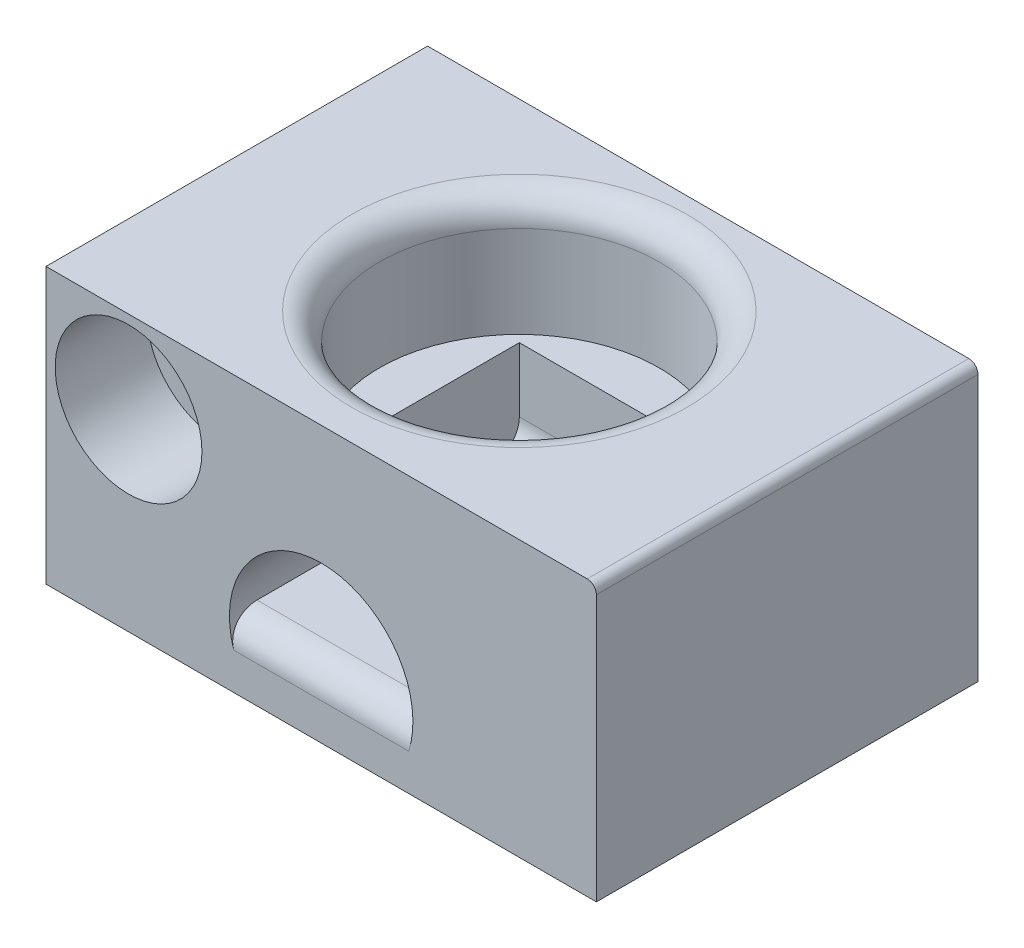
ISO-10303-21;
HEADER;
FILE_DESCRIPTION(('STEP AP214'),'2;1');
FILE_NAME('part.step','',(''),(''),'','','');
FILE_SCHEMA(('AUTOMOTIVE_DESIGN { 1 0 10303 214 1 1 1 1 }'));
ENDSEC;
DATA;
#1=APPLICATION_CONTEXT('core data for automotive mechanical design processes');
#2=APPLICATION_PROTOCOL_DEFINITION('international standard','automotive_design',2000,#1);
#3=PRODUCT_CONTEXT('',#1,'mechanical');
#4=PRODUCT('Part','Part','',(#3));
#5=PRODUCT_RELATED_PRODUCT_CATEGORY('part','',(#4));
#6=PRODUCT_DEFINITION_FORMATION('','',#4);
#7=PRODUCT_DEFINITION_CONTEXT('part definition',#1,'design');
#8=PRODUCT_DEFINITION('design','',#6,#7);
#9=PRODUCT_DEFINITION_SHAPE('','',#8);
#10=(LENGTH_UNIT() NAMED_UNIT(*) SI_UNIT(.MILLI.,.METRE.));
#11=(NAMED_UNIT(*) PLANE_ANGLE_UNIT() SI_UNIT($,.RADIAN.));
#12=(NAMED_UNIT(*) SI_UNIT($,.STERADIAN.) SOLID_ANGLE_UNIT());
#13=UNCERTAINTY_MEASURE_WITH_UNIT(LENGTH_MEASURE(1.E-05),#10,'distance_accuracy_value','');
#14=(GEOMETRIC_REPRESENTATION_CONTEXT(3) GLOBAL_UNCERTAINTY_ASSIGNED_CONTEXT((#13)) GLOBAL_UNIT_ASSIGNED_CONTEXT((#10,
#11,#12)) REPRESENTATION_CONTEXT('',''));
#15=CARTESIAN_POINT('',(0.,0.,0.));
#16=DIRECTION('',(0.,0.,1.));
#17=DIRECTION('',(1.,0.,0.));
#18=AXIS2_PLACEMENT_3D('',#15,#16,#17);
#19=CARTESIAN_POINT('',(0.,70.,0.));
#20=DIRECTION('',(0.,-1.,0.));
#21=DIRECTION('',(0.,0.,-1.));
#22=AXIS2_PLACEMENT_3D('',#19,#20,#21);
#23=PLANE('',#22);
#24=CARTESIAN_POINT('',(0.,70.,-60.));
#25=DIRECTION('',(0.,-1.,0.));
#26=DIRECTION('',(0.,0.,-1.));
#27=AXIS2_PLACEMENT_3D('',#24,#25,#26);
#28=CIRCLE('',#27,18.25);
#29=CARTESIAN_POINT('',(0.,70.,-78.25));
#30=VERTEX_POINT('',#29);
#31=EDGE_CURVE('E348',#30,#30,#28,.T.);
#32=ORIENTED_EDGE('',*,*,#31,.T.);
#33=EDGE_LOOP('',(#32));
#34=FACE_BOUND('',#33,.T.);
#35=DIRECTION('',(-1.,0.,0.));
#36=VECTOR('',#35,1.);
#37=CARTESIAN_POINT('',(30.,70.,-38.4));
#38=LINE('',#37,#36);
#39=CARTESIAN_POINT('',(29.,70.,-38.4));
#40=VERTEX_POINT('',#39);
#41=CARTESIAN_POINT('',(-30.,70.,-38.4));
#42=VERTEX_POINT('',#41);
#43=EDGE_CURVE('E205',#40,#42,#38,.T.);
#44=ORIENTED_EDGE('',*,*,#43,.F.);
#45=DIRECTION('',(0.,0.,1.));
#46=VECTOR('',#45,1.);
#47=CARTESIAN_POINT('',(29.,70.,0.));
#48=LINE('',#47,#46);
#49=CARTESIAN_POINT('',(29.,70.,-80.));
#50=VERTEX_POINT('',#49);
#51=EDGE_CURVE('E49',#40,#50,#48,.F.);
#52=ORIENTED_EDGE('',*,*,#51,.T.);
#53=DIRECTION('',(1.,0.,0.));
#54=VECTOR('',#53,1.);
#55=CARTESIAN_POINT('',(-30.,70.,-80.));
#56=LINE('',#55,#54);
#57=CARTESIAN_POINT('',(-30.,70.,-80.));
#58=VERTEX_POINT('',#57);
#59=EDGE_CURVE('E198',#58,#50,#56,.T.);
#60=ORIENTED_EDGE('',*,*,#59,.F.);
#61=DIRECTION('',(0.,0.,1.));
#62=VECTOR('',#61,1.);
#63=CARTESIAN_POINT('',(-30.,70.,-80.));
#64=LINE('',#63,#62);
#65=EDGE_CURVE('E202',#58,#42,#64,.T.);
#66=ORIENTED_EDGE('',*,*,#65,.T.);
#67=EDGE_LOOP('',(#44,#52,#60,#66));
#68=FACE_BOUND('',#67,.T.);
#69=ADVANCED_FACE('F41',(#34,#68),#23,.F.);
#70=CARTESIAN_POINT('',(-30.,70.,-80.));
#71=DIRECTION('',(1.,0.,0.));
#72=DIRECTION('',(0.,1.,0.));
#73=AXIS2_PLACEMENT_3D('',#70,#71,#72);
#74=PLANE('',#73);
#75=DIRECTION('',(0.,1.,0.));
#76=VECTOR('',#75,1.);
#77=CARTESIAN_POINT('',(-30.,70.,-80.));
#78=LINE('',#77,#76);
#79=CARTESIAN_POINT('',(-30.,40.,-80.));
#80=VERTEX_POINT('',#79);
#81=EDGE_CURVE('E196',#80,#58,#78,.T.);
#82=ORIENTED_EDGE('',*,*,#81,.F.);
#83=DIRECTION('',(0.,0.,-1.));
#84=VECTOR('',#83,1.);
#85=CARTESIAN_POINT('',(-30.,40.,-38.4));
#86=LINE('',#85,#84);
#87=CARTESIAN_POINT('',(-30.,40.,-38.4));
#88=VERTEX_POINT('',#87);
#89=EDGE_CURVE('E56',#88,#80,#86,.T.);
#90=ORIENTED_EDGE('',*,*,#89,.F.);
#91=DIRECTION('',(0.,-1.,0.));
#92=VECTOR('',#91,1.);
#93=CARTESIAN_POINT('',(-30.,70.,-38.4));
#94=LINE('',#93,#92);
#95=EDGE_CURVE('E151',#42,#88,#94,.T.);
#96=ORIENTED_EDGE('',*,*,#95,.F.);
#97=ORIENTED_EDGE('',*,*,#65,.F.);
#98=EDGE_LOOP('',(#82,#90,#96,#97));
#99=FACE_BOUND('',#98,.T.);
#100=ADVANCED_FACE('F257',(#99),#74,.F.);
#101=CARTESIAN_POINT('',(30.,70.,-80.));
#102=DIRECTION('',(-1.,0.,0.));
#103=DIRECTION('',(0.,-1.,0.));
#104=AXIS2_PLACEMENT_3D('',#101,#102,#103);
#105=PLANE('',#104);
#106=DIRECTION('',(0.,1.,0.));
#107=VECTOR('',#106,1.);
#108=CARTESIAN_POINT('',(30.,70.,-38.4));
#109=LINE('',#108,#107);
#110=CARTESIAN_POINT('',(30.,40.,-38.4));
#111=VERTEX_POINT('',#110);
#112=CARTESIAN_POINT('',(30.,69.,-38.4));
#113=VERTEX_POINT('',#112);
#114=EDGE_CURVE('E148',#111,#113,#109,.T.);
#115=ORIENTED_EDGE('',*,*,#114,.F.);
#116=DIRECTION('',(0.,0.,1.));
#117=VECTOR('',#116,1.);
#118=CARTESIAN_POINT('',(30.,40.,-38.4));
#119=LINE('',#118,#117);
#120=CARTESIAN_POINT('',(30.,40.,-80.));
#121=VERTEX_POINT('',#120);
#122=EDGE_CURVE('E134',#121,#111,#119,.T.);
#123=ORIENTED_EDGE('',*,*,#122,.F.);
#124=DIRECTION('',(0.,-1.,0.));
#125=VECTOR('',#124,1.);
#126=CARTESIAN_POINT('',(30.,70.,-80.));
#127=LINE('',#126,#125);
#128=CARTESIAN_POINT('',(30.,69.,-80.));
#129=VERTEX_POINT('',#128);
#130=EDGE_CURVE('E200',#129,#121,#127,.T.);
#131=ORIENTED_EDGE('',*,*,#130,.F.);
#132=DIRECTION('',(0.,0.,1.));
#133=VECTOR('',#132,1.);
#134=CARTESIAN_POINT('',(30.,69.,-80.));
#135=LINE('',#134,#133);
#136=EDGE_CURVE('E156',#129,#113,#135,.T.);
#137=ORIENTED_EDGE('',*,*,#136,.T.);
#138=EDGE_LOOP('',(#115,#123,#131,#137));
#139=FACE_BOUND('',#138,.T.);
#140=ADVANCED_FACE('F154',(#139),#105,.F.);
#141=CARTESIAN_POINT('',(30.,70.,-38.4));
#142=DIRECTION('',(0.,0.,1.));
#143=DIRECTION('',(1.,0.,0.));
#144=AXIS2_PLACEMENT_3D('',#141,#142,#143);
#145=PLANE('',#144);
#146=DIRECTION('',(-1.,0.,0.));
#147=VECTOR('',#146,1.);
#148=CARTESIAN_POINT('',(30.,40.,-38.4));
#149=LINE('',#148,#147);
#150=EDGE_CURVE('E137',#111,#88,#149,.T.);
#151=ORIENTED_EDGE('',*,*,#150,.F.);
#152=ORIENTED_EDGE('',*,*,#114,.T.);
#153=CARTESIAN_POINT('',(29.,69.,-38.4));
#154=DIRECTION('',(0.,0.,1.));
#155=DIRECTION('',(1.,0.,0.));
#156=AXIS2_PLACEMENT_3D('',#153,#154,#155);
#157=CIRCLE('',#156,1.);
#158=EDGE_CURVE('E214',#113,#40,#157,.T.);
#159=ORIENTED_EDGE('',*,*,#158,.T.);
#160=ORIENTED_EDGE('',*,*,#43,.T.);
#161=ORIENTED_EDGE('',*,*,#95,.T.);
#162=EDGE_LOOP('',(#151,#152,#159,#160,#161));
#163=FACE_BOUND('',#162,.T.);
#164=CARTESIAN_POINT('',(-21.,61.,-38.4));
#165=DIRECTION('',(0.,0.,1.));
#166=DIRECTION('',(1.,0.,0.));
#167=AXIS2_PLACEMENT_3D('',#164,#165,#166);
#168=CIRCLE('',#167,8.00000000000001);
#169=CARTESIAN_POINT('',(-13.,61.,-38.4));
#170=VERTEX_POINT('',#169);
#171=EDGE_CURVE('E167',#170,#170,#168,.T.);
#172=ORIENTED_EDGE('',*,*,#171,.F.);
#173=EDGE_LOOP('',(#172));
#174=FACE_BOUND('',#173,.T.);
#175=DIRECTION('',(-1.,0.,0.));
#176=VECTOR('',#175,1.);
#177=CARTESIAN_POINT('',(30.,44.,-38.4));
#178=LINE('',#177,#176);
#179=CARTESIAN_POINT('',(9.53939201416946,44.,-38.4));
#180=VERTEX_POINT('',#179);
#181=CARTESIAN_POINT('',(-9.53939201416946,44.,-38.4));
#182=VERTEX_POINT('',#181);
#183=EDGE_CURVE('E309',#180,#182,#178,.T.);
#184=ORIENTED_EDGE('',*,*,#183,.T.);
#185=CARTESIAN_POINT('',(0.,47.,-38.4));
#186=DIRECTION('',(0.,0.,1.));
#187=DIRECTION('',(1.,0.,0.));
#188=AXIS2_PLACEMENT_3D('',#185,#186,#187);
#189=CIRCLE('',#188,10.);
#190=CARTESIAN_POINT('',(0.,57.,-38.4));
#191=VERTEX_POINT('',#190);
#192=EDGE_CURVE('E288',#182,#191,#189,.F.);
#193=ORIENTED_EDGE('',*,*,#192,.T.);
#194=CARTESIAN_POINT('',(0.,47.,-38.4));
#195=DIRECTION('',(0.,0.,1.));
#196=DIRECTION('',(1.,0.,0.));
#197=AXIS2_PLACEMENT_3D('',#194,#195,#196);
#198=CIRCLE('',#197,10.);
#199=EDGE_CURVE('E287',#191,#180,#198,.F.);
#200=ORIENTED_EDGE('',*,*,#199,.T.);
#201=EDGE_LOOP('',(#184,#193,#200));
#202=FACE_BOUND('',#201,.T.);
#203=ADVANCED_FACE('F146',(#163,#174,#202),#145,.T.);
#204=CARTESIAN_POINT('',(0.,57.,-60.));
#205=DIRECTION('',(0.,1.,0.));
#206=DIRECTION('',(0.,0.,1.));
#207=AXIS2_PLACEMENT_3D('',#204,#205,#206);
#208=PLANE('',#207);
#209=CARTESIAN_POINT('',(0.,57.,-60.));
#210=DIRECTION('',(0.,1.,0.));
#211=DIRECTION('',(0.,0.,1.));
#212=AXIS2_PLACEMENT_3D('',#209,#210,#211);
#213=CIRCLE('',#212,15.25);
#214=CARTESIAN_POINT('',(9.99999999999998,57.,-48.4864210603305));
#215=VERTEX_POINT('',#214);
#216=CARTESIAN_POINT('',(-10.,57.,-48.4864210603306));
#217=VERTEX_POINT('',#216);
#218=EDGE_CURVE('E192',#215,#217,#213,.T.);
#219=ORIENTED_EDGE('',*,*,#218,.T.);
#220=DIRECTION('',(0.,0.,1.));
#221=VECTOR('',#220,1.);
#222=CARTESIAN_POINT('',(-10.,57.,-50.));
#223=LINE('',#222,#221);
#224=CARTESIAN_POINT('',(-10.,57.,-70.));
#225=VERTEX_POINT('',#224);
#226=EDGE_CURVE('E181',#225,#217,#223,.T.);
#227=ORIENTED_EDGE('',*,*,#226,.F.);
#228=DIRECTION('',(-1.,0.,0.));
#229=VECTOR('',#228,1.);
#230=CARTESIAN_POINT('',(10.,57.,-70.));
#231=LINE('',#230,#229);
#232=CARTESIAN_POINT('',(10.,57.,-70.));
#233=VERTEX_POINT('',#232);
#234=EDGE_CURVE('E187',#233,#225,#231,.T.);
#235=ORIENTED_EDGE('',*,*,#234,.F.);
#236=DIRECTION('',(0.,0.,-1.));
#237=VECTOR('',#236,1.);
#238=CARTESIAN_POINT('',(10.,57.,-50.));
#239=LINE('',#238,#237);
#240=EDGE_CURVE('E184',#215,#233,#239,.T.);
#241=ORIENTED_EDGE('',*,*,#240,.F.);
#242=EDGE_LOOP('',(#219,#227,#235,#241));
#243=FACE_BOUND('',#242,.T.);
#244=ADVANCED_FACE('F299',(#243),#208,.T.);
#245=CARTESIAN_POINT('',(0.,0.,-80.));
#246=DIRECTION('',(0.,0.,1.));
#247=DIRECTION('',(1.,0.,0.));
#248=AXIS2_PLACEMENT_3D('',#245,#246,#247);
#249=PLANE('',#248);
#250=CARTESIAN_POINT('',(-21.,61.,-80.));
#251=DIRECTION('',(0.,0.,1.));
#252=DIRECTION('',(1.,0.,0.));
#253=AXIS2_PLACEMENT_3D('',#250,#251,#252);
#254=CIRCLE('',#253,3.);
#255=CARTESIAN_POINT('',(-18.,61.,-80.));
#256=VERTEX_POINT('',#255);
#257=EDGE_CURVE('E160',#256,#256,#254,.F.);
#258=ORIENTED_EDGE('',*,*,#257,.F.);
#259=EDGE_LOOP('',(#258));
#260=FACE_BOUND('',#259,.T.);
#261=ORIENTED_EDGE('',*,*,#130,.T.);
#262=DIRECTION('',(1.,0.,0.));
#263=VECTOR('',#262,1.);
#264=CARTESIAN_POINT('',(30.,40.,-80.));
#265=LINE('',#264,#263);
#266=EDGE_CURVE('E138',#80,#121,#265,.T.);
#267=ORIENTED_EDGE('',*,*,#266,.F.);
#268=ORIENTED_EDGE('',*,*,#81,.T.);
#269=ORIENTED_EDGE('',*,*,#59,.T.);
#270=CARTESIAN_POINT('',(29.,69.,-80.));
#271=DIRECTION('',(0.,0.,1.));
#272=DIRECTION('',(1.,0.,0.));
#273=AXIS2_PLACEMENT_3D('',#270,#271,#272);
#274=CIRCLE('',#273,1.);
#275=EDGE_CURVE('E12',#50,#129,#274,.F.);
#276=ORIENTED_EDGE('',*,*,#275,.T.);
#277=EDGE_LOOP('',(#261,#267,#268,#269,#276));
#278=FACE_BOUND('',#277,.T.);
#279=ADVANCED_FACE('F297',(#260,#278),#249,.F.);
#280=CARTESIAN_POINT('',(0.,57.,-60.));
#281=DIRECTION('',(0.,1.,0.));
#282=DIRECTION('',(0.,0.,1.));
#283=AXIS2_PLACEMENT_3D('',#280,#281,#282);
#284=CYLINDRICAL_SURFACE('',#283,15.25);
#285=CARTESIAN_POINT('',(0.,67.,-60.));
#286=DIRECTION('',(0.,-1.,0.));
#287=DIRECTION('',(0.,0.,-1.));
#288=AXIS2_PLACEMENT_3D('',#285,#286,#287);
#289=CIRCLE('',#288,15.25);
#290=CARTESIAN_POINT('',(0.,67.,-75.25));
#291=VERTEX_POINT('',#290);
#292=EDGE_CURVE('E208',#291,#291,#289,.F.);
#293=ORIENTED_EDGE('',*,*,#292,.T.);
#294=EDGE_LOOP('',(#293));
#295=FACE_BOUND('',#294,.T.);
#296=ORIENTED_EDGE('',*,*,#218,.F.);
#297=DIRECTION('',(0.,1.,0.));
#298=VECTOR('',#297,1.);
#299=CARTESIAN_POINT('',(10.,47.,-48.4864210603305));
#300=LINE('',#299,#298);
#301=CARTESIAN_POINT('',(10.,47.,-48.4864210603305));
#302=VERTEX_POINT('',#301);
#303=EDGE_CURVE('E347',#302,#215,#300,.T.);
#304=ORIENTED_EDGE('',*,*,#303,.F.);
#305=CARTESIAN_POINT('',(10.,47.,-48.4864210603305));
#306=CARTESIAN_POINT('',(10.0000018849005,47.1235247431752,-48.4864265566067));
#307=CARTESIAN_POINT('',(9.99771060894553,47.2470289889145,-48.4844321932146));
#308=CARTESIAN_POINT('',(9.98856657748191,47.4937302351308,-48.4764982891699));
#309=CARTESIAN_POINT('',(9.9817142511147,47.6169272634189,-48.4705591196774));
#310=CARTESIAN_POINT('',(9.95438004886105,47.9853191650965,-48.4469296150537));
#311=CARTESIAN_POINT('',(9.92712078476385,48.2296921452646,-48.4234269518624));
#312=CARTESIAN_POINT('',(9.85541718624214,48.711599412089,-48.362327589392));
#313=CARTESIAN_POINT('',(9.81114052396376,48.9491768509782,-48.324868509388));
#314=CARTESIAN_POINT('',(9.7061494118778,49.4183617655951,-48.2374397621987));
#315=CARTESIAN_POINT('',(9.64543046796156,49.6499675901401,-48.187466674887));
#316=CARTESIAN_POINT('',(9.50875880474501,50.1047725992668,-48.0771792361707));
#317=CARTESIAN_POINT('',(9.43288270379108,50.3280076149206,-48.0169171092058));
#318=CARTESIAN_POINT('',(9.26658700115376,50.7663445578464,-47.8878586178224));
#319=CARTESIAN_POINT('',(9.17616807702618,50.9814468634483,-47.8190626510329));
#320=CARTESIAN_POINT('',(8.88367013065928,51.6148629113232,-47.6023526590485));
#321=CARTESIAN_POINT('',(8.66063739422604,52.0203439356527,-47.444359392989));
#322=CARTESIAN_POINT('',(8.26991707289425,52.6283321933574,-47.1859318422121));
#323=CARTESIAN_POINT('',(8.11904461814495,52.8438088603468,-47.0896019870512));
#324=CARTESIAN_POINT('',(7.8012071565086,53.2617924640205,-46.8951028305589));
#325=CARTESIAN_POINT('',(7.6342410808012,53.4642985378042,-46.7969334074061));
#326=CARTESIAN_POINT('',(7.28474761134307,53.8557531302245,-46.6009280238679));
#327=CARTESIAN_POINT('',(7.10221273364695,54.0446950472643,-46.5030922476354));
#328=CARTESIAN_POINT('',(6.7221524461765,54.4082260199175,-46.3098349534029));
#329=CARTESIAN_POINT('',(6.52462612473937,54.5828142013015,-46.2144135826995));
#330=CARTESIAN_POINT('',(6.08659464030325,54.9400225850521,-46.0149528803383));
#331=CARTESIAN_POINT('',(5.84393468941768,55.1203763242062,-45.9115635766194));
#332=CARTESIAN_POINT('',(5.34081084338473,55.4597764906638,-45.7132453691171));
#333=CARTESIAN_POINT('',(5.08034457836178,55.6188200733885,-45.6183175953832));
#334=CARTESIAN_POINT('',(4.54357932558624,55.9134384593686,-45.4398426362878));
#335=CARTESIAN_POINT('',(4.26731877271722,56.0490672555367,-45.3562693657258));
#336=CARTESIAN_POINT('',(3.70025458014258,56.2953535556659,-45.202810558604));
#337=CARTESIAN_POINT('',(3.40945475290906,56.4060175643471,-45.1329214571828));
#338=CARTESIAN_POINT('',(2.8659537154468,56.5840332595722,-45.0196018828244));
#339=CARTESIAN_POINT('',(2.61512518946837,56.6555446234183,-44.9736957310099));
#340=CARTESIAN_POINT('',(2.1068632215921,56.7790334645464,-44.8940487035402));
#341=CARTESIAN_POINT('',(1.84943153546096,56.8310160781264,-44.8603046292062));
#342=CARTESIAN_POINT('',(1.32798663605259,56.9149712823803,-44.8056548109271));
#343=CARTESIAN_POINT('',(1.06393922667638,56.946795985804,-44.7848439713426));
#344=CARTESIAN_POINT('',(0.666029056632956,56.9786854489468,-44.7639700622507));
#345=CARTESIAN_POINT('',(0.533013608341554,56.9866740303539,-44.7587357896097));
#346=CARTESIAN_POINT('',(0.266672382906099,56.9973321324622,-44.7517495813222));
#347=CARTESIAN_POINT('',(0.133346591439545,57.0000014025983,-44.7499978097181));
#348=CARTESIAN_POINT('',(0.,57.,-44.75));
#349=B_SPLINE_CURVE_WITH_KNOTS('',3,(#305,#306,#307,#308,#309,#310,#311,#312,#313,#314,#315,
#316,#317,#318,#319,#320,#321,#322,#323,#324,#325,#326,#327,#328,#329,#330,#331,#332,#333,#334,
#335,#336,#337,#338,#339,#340,#341,#342,#343,#344,#345,#346,#347,#348),.UNSPECIFIED.,.F.,.F.,(4,
2,2,2,2,2,2,2,2,2,2,2,2,2,2,2,2,2,2,2,2,4),(0.,0.370496843521364,0.740958832553857,
1.48075581513419,2.21344309095856,2.94633083200436,3.67560358184817,4.40484236442597,
5.86633391144131,6.70613084604482,7.54598359228488,8.38624235716382,9.22655226103944,
10.1838661909247,11.1413077804927,12.0965111969941,13.0514654415057,13.8449401792403,
14.6382060771492,15.4372262950138,15.837167915056,16.2371283738181),.UNSPECIFIED.);
#350=CARTESIAN_POINT('',(0.,57.,-44.75));
#351=VERTEX_POINT('',#350);
#352=EDGE_CURVE('E303',#302,#351,#349,.T.);
#353=ORIENTED_EDGE('',*,*,#352,.T.);
#354=CARTESIAN_POINT('',(0.,57.,-44.75));
#355=CARTESIAN_POINT('',(-0.126498296511818,57.0000010939714,-44.7499982573611));
#356=CARTESIAN_POINT('',(-0.252978714306003,56.9975991655513,-44.7515744492757));
#357=CARTESIAN_POINT('',(-0.505673795606043,56.9880068139838,-44.7578623160153));
#358=CARTESIAN_POINT('',(-0.63188847157635,56.9808166206832,-44.7625738403377));
#359=CARTESIAN_POINT('',(-1.00960805889371,56.9521047527717,-44.7813711560163));
#360=CARTESIAN_POINT('',(-1.26038915115504,56.9234417308187,-44.8001197554121));
#361=CARTESIAN_POINT('',(-1.75638559077915,56.847725962843,-44.8494424904838));
#362=CARTESIAN_POINT('',(-2.0016251720529,56.8007836214486,-44.8799456191083));
#363=CARTESIAN_POINT('',(-2.48638317984543,56.68915688729,-44.9520617225179));
#364=CARTESIAN_POINT('',(-2.72590106713438,56.6244708294188,-44.9936757399619));
#365=CARTESIAN_POINT('',(-3.19714836816602,56.4783427229131,-45.0869745747234));
#366=CARTESIAN_POINT('',(-3.4288933719232,56.3969368776441,-45.1386376202836));
#367=CARTESIAN_POINT('',(-3.88396304254489,56.2181680394765,-45.2510241331542));
#368=CARTESIAN_POINT('',(-4.10728437813163,56.1207988133178,-45.3117511388577));
#369=CARTESIAN_POINT('',(-4.5445371646156,55.9110059778273,-45.4410954266088));
#370=CARTESIAN_POINT('',(-4.75846233993221,55.7985725043348,-45.5097178744449));
#371=CARTESIAN_POINT('',(-5.17603949702021,55.5595861902265,-45.6535750794153));
#372=CARTESIAN_POINT('',(-5.37968763187592,55.4330281185722,-45.7288122841178));
#373=CARTESIAN_POINT('',(-5.79238996687338,55.1556750161666,-45.8910011240755));
#374=CARTESIAN_POINT('',(-6.00050028193417,55.0037413721279,-45.9784070209176));
#375=CARTESIAN_POINT('',(-6.40323059135865,54.6853459315916,-46.1576833391161));
#376=CARTESIAN_POINT('',(-6.59785010329197,54.5188836160297,-46.2495539199297));
#377=CARTESIAN_POINT('',(-6.97340308611408,54.1719668378327,-46.4361442039054));
#378=CARTESIAN_POINT('',(-7.15431294045502,53.991489268244,-46.5308684475287));
#379=CARTESIAN_POINT('',(-7.50161147035732,53.6174739422994,-46.7211619161492));
#380=CARTESIAN_POINT('',(-7.66799925244541,53.4239353836607,-46.8167311927394));
#381=CARTESIAN_POINT('',(-8.01010219782275,52.9937401217036,-47.0213129619998));
#382=CARTESIAN_POINT('',(-8.183342192412,52.7550197119938,-47.1301423160809));
#383=CARTESIAN_POINT('',(-8.50894983087163,52.2616670409154,-47.3430602542396));
#384=CARTESIAN_POINT('',(-8.66131401306442,52.0070321507387,-47.4471480501549));
#385=CARTESIAN_POINT('',(-8.94342841543615,51.4836498808629,-47.6465667098481));
#386=CARTESIAN_POINT('',(-9.07326456964939,51.2149614557319,-47.7419301636378));
#387=CARTESIAN_POINT('',(-9.30956913041764,50.6635806165464,-47.9204153647054));
#388=CARTESIAN_POINT('',(-9.41604303348889,50.3808915157041,-48.0035399899366));
#389=CARTESIAN_POINT('',(-9.589024762243,49.8488529429409,-48.1415285572577));
#390=CARTESIAN_POINT('',(-9.65919167971446,49.6013148958413,-48.1987833342465));
#391=CARTESIAN_POINT('',(-9.78065160292891,49.0989503277042,-48.2992488091573));
#392=CARTESIAN_POINT('',(-9.83195371448082,48.8441273871805,-48.3424662815341));
#393=CARTESIAN_POINT('',(-9.91518194483236,48.3261470649039,-48.4131659156969));
#394=CARTESIAN_POINT('',(-9.94688770190996,48.0629287030309,-48.4404689311285));
#395=CARTESIAN_POINT('',(-9.97870124324069,47.6657646408239,-48.4679492805795));
#396=CARTESIAN_POINT('',(-9.98668165189904,47.5328498876062,-48.4748638547972));
#397=CARTESIAN_POINT('',(-9.99733267619627,47.2666320296341,-48.4841038039169));
#398=CARTESIAN_POINT('',(-10.0000026104667,47.1333288772428,-48.486428589919));
#399=CARTESIAN_POINT('',(-10.,47.,-48.4864210603305));
#400=B_SPLINE_CURVE_WITH_KNOTS('',3,(#354,#355,#356,#357,#358,#359,#360,#361,#362,#363,#364,
#365,#366,#367,#368,#369,#370,#371,#372,#373,#374,#375,#376,#377,#378,#379,#380,#381,#382,#383,
#384,#385,#386,#387,#388,#389,#390,#391,#392,#393,#394,#395,#396,#397,#398,#399),.UNSPECIFIED.,
.F.,.F.,(4,2,2,2,2,2,2,2,2,2,2,2,2,2,2,2,2,2,2,2,2,2,4),(0.,0.379426897639214,0.758835583296715,
1.51705331889421,2.27076083176904,3.02453909831615,3.7767020972547,4.52915949768475,
5.28211204200038,6.03534437314495,6.85081992984347,7.66632463287497,8.48320363192109,
9.30013285422677,10.2421952800565,11.1844137323755,12.1229550241933,13.0612752648758,
13.8509723530497,14.6402877622747,15.4383248329922,15.8381631197545,16.2380527050638),.UNSPECIFIED.);
#401=CARTESIAN_POINT('',(-10.,47.,-48.4864210603306));
#402=VERTEX_POINT('',#401);
#403=EDGE_CURVE('E278',#351,#402,#400,.T.);
#404=ORIENTED_EDGE('',*,*,#403,.T.);
#405=DIRECTION('',(0.,1.,0.));
#406=VECTOR('',#405,1.);
#407=CARTESIAN_POINT('',(-10.,57.,-48.4864210603306));
#408=LINE('',#407,#406);
#409=EDGE_CURVE('E344',#217,#402,#408,.F.);
#410=ORIENTED_EDGE('',*,*,#409,.F.);
#411=EDGE_LOOP('',(#296,#304,#353,#404,#410));
#412=FACE_BOUND('',#411,.T.);
#413=ADVANCED_FACE('F291',(#295,#412),#284,.F.);
#414=CARTESIAN_POINT('',(-10.,47.,-50.));
#415=DIRECTION('',(-1.,0.,0.));
#416=DIRECTION('',(0.,0.,1.));
#417=AXIS2_PLACEMENT_3D('',#414,#415,#416);
#418=PLANE('',#417);
#419=DIRECTION('',(0.,0.,1.));
#420=VECTOR('',#419,1.);
#421=CARTESIAN_POINT('',(-10.,47.,-50.));
#422=LINE('',#421,#420);
#423=CARTESIAN_POINT('',(-10.,47.,-67.));
#424=VERTEX_POINT('',#423);
#425=EDGE_CURVE('E174',#424,#402,#422,.T.);
#426=ORIENTED_EDGE('',*,*,#425,.F.);
#427=CARTESIAN_POINT('',(-10.,50.,-67.));
#428=DIRECTION('',(-1.,0.,0.));
#429=DIRECTION('',(0.,0.,1.));
#430=AXIS2_PLACEMENT_3D('',#427,#428,#429);
#431=CIRCLE('',#430,3.);
#432=CARTESIAN_POINT('',(-10.,50.,-70.));
#433=VERTEX_POINT('',#432);
#434=EDGE_CURVE('E319',#424,#433,#431,.F.);
#435=ORIENTED_EDGE('',*,*,#434,.T.);
#436=DIRECTION('',(0.,1.,0.));
#437=VECTOR('',#436,1.);
#438=CARTESIAN_POINT('',(-10.,47.,-70.));
#439=LINE('',#438,#437);
#440=EDGE_CURVE('E190',#433,#225,#439,.T.);
#441=ORIENTED_EDGE('',*,*,#440,.T.);
#442=ORIENTED_EDGE('',*,*,#226,.T.);
#443=ORIENTED_EDGE('',*,*,#409,.T.);
#444=EDGE_LOOP('',(#426,#435,#441,#442,#443));
#445=FACE_BOUND('',#444,.T.);
#446=ADVANCED_FACE('F296',(#445),#418,.F.);
#447=CARTESIAN_POINT('',(10.,47.,-70.));
#448=DIRECTION('',(0.,0.,-1.));
#449=DIRECTION('',(-1.,0.,0.));
#450=AXIS2_PLACEMENT_3D('',#447,#448,#449);
#451=PLANE('',#450);
#452=ORIENTED_EDGE('',*,*,#440,.F.);
#453=DIRECTION('',(-1.,0.,0.));
#454=VECTOR('',#453,1.);
#455=CARTESIAN_POINT('',(10.,50.,-70.));
#456=LINE('',#455,#454);
#457=CARTESIAN_POINT('',(10.,50.,-70.));
#458=VERTEX_POINT('',#457);
#459=EDGE_CURVE('E321',#433,#458,#456,.F.);
#460=ORIENTED_EDGE('',*,*,#459,.T.);
#461=DIRECTION('',(0.,1.,0.));
#462=VECTOR('',#461,1.);
#463=CARTESIAN_POINT('',(10.,47.,-70.));
#464=LINE('',#463,#462);
#465=EDGE_CURVE('E180',#458,#233,#464,.T.);
#466=ORIENTED_EDGE('',*,*,#465,.T.);
#467=ORIENTED_EDGE('',*,*,#234,.T.);
#468=EDGE_LOOP('',(#452,#460,#466,#467));
#469=FACE_BOUND('',#468,.T.);
#470=ADVANCED_FACE('F338',(#469),#451,.F.);
#471=CARTESIAN_POINT('',(10.,47.,-50.));
#472=DIRECTION('',(1.,0.,0.));
#473=DIRECTION('',(0.,0.,-1.));
#474=AXIS2_PLACEMENT_3D('',#471,#472,#473);
#475=PLANE('',#474);
#476=ORIENTED_EDGE('',*,*,#465,.F.);
#477=CARTESIAN_POINT('',(10.,50.,-67.));
#478=DIRECTION('',(1.,0.,0.));
#479=DIRECTION('',(0.,0.,-1.));
#480=AXIS2_PLACEMENT_3D('',#477,#478,#479);
#481=CIRCLE('',#480,3.);
#482=CARTESIAN_POINT('',(10.,47.,-67.));
#483=VERTEX_POINT('',#482);
#484=EDGE_CURVE('E223',#458,#483,#481,.F.);
#485=ORIENTED_EDGE('',*,*,#484,.T.);
#486=DIRECTION('',(0.,0.,-1.));
#487=VECTOR('',#486,1.);
#488=CARTESIAN_POINT('',(10.,47.,-50.));
#489=LINE('',#488,#487);
#490=EDGE_CURVE('E176',#302,#483,#489,.T.);
#491=ORIENTED_EDGE('',*,*,#490,.F.);
#492=ORIENTED_EDGE('',*,*,#303,.T.);
#493=ORIENTED_EDGE('',*,*,#240,.T.);
#494=EDGE_LOOP('',(#476,#485,#491,#492,#493));
#495=FACE_BOUND('',#494,.T.);
#496=ADVANCED_FACE('F326',(#495),#475,.F.);
#497=CARTESIAN_POINT('',(0.,47.,0.));
#498=DIRECTION('',(0.,1.,0.));
#499=DIRECTION('',(0.,0.,1.));
#500=AXIS2_PLACEMENT_3D('',#497,#498,#499);
#501=PLANE('',#500);
#502=CARTESIAN_POINT('',(-10.,47.,-41.4));
#503=VERTEX_POINT('',#502);
#504=EDGE_CURVE('E177',#402,#503,#422,.T.);
#505=ORIENTED_EDGE('',*,*,#504,.T.);
#506=DIRECTION('',(-1.,0.,0.));
#507=VECTOR('',#506,1.);
#508=CARTESIAN_POINT('',(0.,47.,-41.4));
#509=LINE('',#508,#507);
#510=CARTESIAN_POINT('',(10.,47.,-41.4));
#511=VERTEX_POINT('',#510);
#512=EDGE_CURVE('E317',#503,#511,#509,.F.);
#513=ORIENTED_EDGE('',*,*,#512,.T.);
#514=EDGE_CURVE('E178',#511,#302,#489,.T.);
#515=ORIENTED_EDGE('',*,*,#514,.T.);
#516=ORIENTED_EDGE('',*,*,#490,.T.);
#517=DIRECTION('',(-1.,0.,0.));
#518=VECTOR('',#517,1.);
#519=CARTESIAN_POINT('',(0.,47.,-67.));
#520=LINE('',#519,#518);
#521=EDGE_CURVE('E314',#483,#424,#520,.T.);
#522=ORIENTED_EDGE('',*,*,#521,.T.);
#523=ORIENTED_EDGE('',*,*,#425,.T.);
#524=EDGE_LOOP('',(#505,#513,#515,#516,#522,#523));
#525=FACE_BOUND('',#524,.T.);
#526=ADVANCED_FACE('F271',(#525),#501,.T.);
#527=CARTESIAN_POINT('',(0.,67.,-60.));
#528=DIRECTION('',(0.,-1.,0.));
#529=DIRECTION('',(0.,0.,-1.));
#530=AXIS2_PLACEMENT_3D('',#527,#528,#529);
#531=TOROIDAL_SURFACE('',#530,18.25,3.);
#532=ORIENTED_EDGE('',*,*,#31,.F.);
#533=EDGE_LOOP('',(#532));
#534=FACE_BOUND('',#533,.T.);
#535=ORIENTED_EDGE('',*,*,#292,.F.);
#536=EDGE_LOOP('',(#535));
#537=FACE_BOUND('',#536,.T.);
#538=ADVANCED_FACE('F269',(#534,#537),#531,.T.);
#539=CARTESIAN_POINT('',(0.,47.,-80.001));
#540=DIRECTION('',(0.,0.,1.));
#541=DIRECTION('',(1.,0.,0.));
#542=AXIS2_PLACEMENT_3D('',#539,#540,#541);
#543=CYLINDRICAL_SURFACE('',#542,10.);
#544=DIRECTION('',(0.,0.,1.));
#545=VECTOR('',#544,1.);
#546=CARTESIAN_POINT('',(0.,57.,-80.001));
#547=LINE('',#546,#545);
#548=EDGE_CURVE('E171',#351,#191,#547,.T.);
#549=ORIENTED_EDGE('',*,*,#548,.F.);
#550=ORIENTED_EDGE('',*,*,#352,.F.);
#551=ORIENTED_EDGE('',*,*,#514,.F.);
#552=CARTESIAN_POINT('',(10.,47.,-41.4));
#553=CARTESIAN_POINT('',(9.9999920730505,47.0000080474252,-41.315695332883));
#554=CARTESIAN_POINT('',(9.99999979342651,46.9964463867688,-41.2313945026641));
#555=CARTESIAN_POINT('',(9.99998885644327,46.9822459428319,-41.0633946215108));
#556=CARTESIAN_POINT('',(9.99997020024936,46.9716074722235,-40.9796955441545));
#557=CARTESIAN_POINT('',(9.9998488834943,46.9433241459584,-40.8135353884343));
#558=CARTESIAN_POINT('',(9.99974627314504,46.9256834814681,-40.7310736000764));
#559=CARTESIAN_POINT('',(9.99934380379034,46.8835389071938,-40.5679483058731));
#560=CARTESIAN_POINT('',(9.99904394720656,46.8590350816735,-40.4872847779624));
#561=CARTESIAN_POINT('',(9.99763599620693,46.7754239410328,-40.2487615065013));
#562=CARTESIAN_POINT('',(9.99601966766726,46.7062068214481,-40.0943098169297));
#563=CARTESIAN_POINT('',(9.98987970174822,46.5429094251339,-39.7993559596941));
#564=CARTESIAN_POINT('',(9.98535654386272,46.4488332505179,-39.6588514957881));
#565=CARTESIAN_POINT('',(9.97155016812497,46.2389644528753,-39.3962114899694));
#566=CARTESIAN_POINT('',(9.96228485755556,46.1232545588464,-39.2740090640972));
#567=CARTESIAN_POINT('',(9.9371347621394,45.8734734138726,-39.0509305436526));
#568=CARTESIAN_POINT('',(9.92125113059913,45.7394053647454,-38.9500507380215));
#569=CARTESIAN_POINT('',(9.88161281253259,45.4594189727541,-38.7737765761097));
#570=CARTESIAN_POINT('',(9.8579824298941,45.3137136260604,-38.6980154825242));
#571=CARTESIAN_POINT('',(9.80186223703675,45.0133437293246,-38.5716315392191));
#572=CARTESIAN_POINT('',(9.76937224340081,44.858678993852,-38.5210092099989));
#573=CARTESIAN_POINT('',(9.70496992423446,44.5859151138216,-38.4553438553204));
#574=CARTESIAN_POINT('',(9.67507641142725,44.4686910138774,-38.4344879704897));
#575=CARTESIAN_POINT('',(9.61065287408428,44.2340790228927,-38.4068113184387));
#576=CARTESIAN_POINT('',(9.57613110175253,44.1166917831583,-38.3999659159425));
#577=CARTESIAN_POINT('',(9.53939201416946,44.,-38.4));
#578=B_SPLINE_CURVE_WITH_KNOTS('',3,(#552,#553,#554,#555,#556,#557,#558,#559,#560,#561,#562,
#563,#564,#565,#566,#567,#568,#569,#570,#571,#572,#573,#574,#575,#576,#577),.UNSPECIFIED.,.F.,
.F.,(4,2,2,2,2,2,2,2,2,2,2,2,4),(0.,0.252831865688309,0.505652561346423,0.758322158702964,
1.01098865400483,1.51614355640543,2.0212151527382,2.52439342055278,3.027484041331,
3.52286783153687,4.01826187825971,4.38568561449546,4.75246273569221),.UNSPECIFIED.);
#579=EDGE_CURVE('E215',#511,#180,#578,.T.);
#580=ORIENTED_EDGE('',*,*,#579,.T.);
#581=ORIENTED_EDGE('',*,*,#199,.F.);
#582=EDGE_LOOP('',(#549,#550,#551,#580,#581));
#583=FACE_BOUND('',#582,.T.);
#584=ADVANCED_FACE('F237',(#583),#543,.F.);
#585=CARTESIAN_POINT('',(0.,47.,-50.));
#586=DIRECTION('',(0.,0.,1.));
#587=DIRECTION('',(1.,0.,0.));
#588=AXIS2_PLACEMENT_3D('',#585,#586,#587);
#589=CYLINDRICAL_SURFACE('',#588,10.);
#590=ORIENTED_EDGE('',*,*,#403,.F.);
#591=ORIENTED_EDGE('',*,*,#548,.T.);
#592=ORIENTED_EDGE('',*,*,#192,.F.);
#593=CARTESIAN_POINT('',(-9.53939201416946,44.,-38.4));
#594=CARTESIAN_POINT('',(-9.56460809142414,44.0801508392346,-38.399991462902));
#595=CARTESIAN_POINT('',(-9.58879857018928,44.16063228141,-38.4032123634777));
#596=CARTESIAN_POINT('',(-9.6350246792201,44.3217033890142,-38.4162063690084));
#597=CARTESIAN_POINT('',(-9.65705981680343,44.4022930749382,-38.4259809680595));
#598=CARTESIAN_POINT('',(-9.69885852441176,44.5629849697561,-38.4521748684499));
#599=CARTESIAN_POINT('',(-9.71862225374354,44.6430872124636,-38.4685937034254));
#600=CARTESIAN_POINT('',(-9.75582742399094,44.8021559612666,-38.508067720926));
#601=CARTESIAN_POINT('',(-9.77326909682137,44.8811225800785,-38.5311222399856));
#602=CARTESIAN_POINT('',(-9.8221581712132,45.1156903600768,-38.6103006268961));
#603=CARTESIAN_POINT('',(-9.85012761483993,45.268795795836,-38.6764130345007));
#604=CARTESIAN_POINT('',(-9.89730002017988,45.5627500556097,-38.8337525587794));
#605=CARTESIAN_POINT('',(-9.91650863331632,45.7036067334302,-38.9249634239119));
#606=CARTESIAN_POINT('',(-9.94721249210412,45.965601261763,-39.1277291720002));
#607=CARTESIAN_POINT('',(-9.95887357876502,46.0871154039993,-39.2387729337715));
#608=CARTESIAN_POINT('',(-9.97683676259763,46.310557157785,-39.4795024249142));
#609=CARTESIAN_POINT('',(-9.98313689581703,46.4124775807206,-39.6091949658291));
#610=CARTESIAN_POINT('',(-9.99219875386564,46.5945637636318,-39.8848196618765));
#611=CARTESIAN_POINT('',(-9.99492822189612,46.6745261167531,-40.0308870906472));
#612=CARTESIAN_POINT('',(-9.99840732705459,46.8092049455948,-40.3342220188471));
#613=CARTESIAN_POINT('',(-9.99915769263595,46.8639307040919,-40.4914853754672));
#614=CARTESIAN_POINT('',(-9.99985067189834,46.9367119283152,-40.7741996214682));
#615=CARTESIAN_POINT('',(-9.99994390579853,46.9604156148073,-40.8982290047279));
#616=CARTESIAN_POINT('',(-9.99999965951983,46.9920684324163,-41.1481573078353));
#617=CARTESIAN_POINT('',(-9.99996230754522,47.00003300358,-41.2740542732791));
#618=CARTESIAN_POINT('',(-10.,47.,-41.4));
#619=B_SPLINE_CURVE_WITH_KNOTS('',3,(#593,#594,#595,#596,#597,#598,#599,#600,#601,#602,#603,
#604,#605,#606,#607,#608,#609,#610,#611,#612,#613,#614,#615,#616,#617,#618),.UNSPECIFIED.,.F.,
.F.,(4,2,2,2,2,2,2,2,2,2,2,2,4),(0.,0.252012827109153,0.504083127030989,0.756135737024462,
1.00816315441195,1.51272431595966,2.01695953400225,2.50970101819745,3.00262293758511,
3.49996776526983,3.99712950839467,4.37499373589962,4.75248709482411),.UNSPECIFIED.);
#620=EDGE_CURVE('E217',#182,#503,#619,.T.);
#621=ORIENTED_EDGE('',*,*,#620,.T.);
#622=ORIENTED_EDGE('',*,*,#504,.F.);
#623=EDGE_LOOP('',(#590,#591,#592,#621,#622));
#624=FACE_BOUND('',#623,.T.);
#625=ADVANCED_FACE('F243',(#624),#589,.F.);
#626=CARTESIAN_POINT('',(30.,44.,-41.4));
#627=DIRECTION('',(-1.,0.,0.));
#628=DIRECTION('',(0.,0.,1.));
#629=AXIS2_PLACEMENT_3D('',#626,#627,#628);
#630=CYLINDRICAL_SURFACE('',#629,3.);
#631=ORIENTED_EDGE('',*,*,#579,.F.);
#632=ORIENTED_EDGE('',*,*,#512,.F.);
#633=ORIENTED_EDGE('',*,*,#620,.F.);
#634=ORIENTED_EDGE('',*,*,#183,.F.);
#635=EDGE_LOOP('',(#631,#632,#633,#634));
#636=FACE_BOUND('',#635,.T.);
#637=ADVANCED_FACE('F239',(#636),#630,.T.);
#638=CARTESIAN_POINT('',(0.,50.,-67.));
#639=DIRECTION('',(-1.,0.,0.));
#640=DIRECTION('',(0.,0.,1.));
#641=AXIS2_PLACEMENT_3D('',#638,#639,#640);
#642=CYLINDRICAL_SURFACE('',#641,3.);
#643=ORIENTED_EDGE('',*,*,#484,.F.);
#644=ORIENTED_EDGE('',*,*,#459,.F.);
#645=ORIENTED_EDGE('',*,*,#434,.F.);
#646=ORIENTED_EDGE('',*,*,#521,.F.);
#647=EDGE_LOOP('',(#643,#644,#645,#646));
#648=FACE_BOUND('',#647,.T.);
#649=ADVANCED_FACE('F242',(#648),#642,.F.);
#650=CARTESIAN_POINT('',(-21.,61.,-48.4));
#651=DIRECTION('',(0.,0.,1.));
#652=DIRECTION('',(1.,0.,0.));
#653=AXIS2_PLACEMENT_3D('',#650,#651,#652);
#654=CYLINDRICAL_SURFACE('',#653,8.00000000000001);
#655=CARTESIAN_POINT('',(-21.,61.,-48.4));
#656=DIRECTION('',(0.,0.,1.));
#657=DIRECTION('',(1.,0.,0.));
#658=AXIS2_PLACEMENT_3D('',#655,#656,#657);
#659=CIRCLE('',#658,8.00000000000001);
#660=CARTESIAN_POINT('',(-13.,61.,-48.4));
#661=VERTEX_POINT('',#660);
#662=EDGE_CURVE('E168',#661,#661,#659,.T.);
#663=ORIENTED_EDGE('',*,*,#662,.F.);
#664=EDGE_LOOP('',(#663));
#665=FACE_BOUND('',#664,.T.);
#666=ORIENTED_EDGE('',*,*,#171,.T.);
#667=EDGE_LOOP('',(#666));
#668=FACE_BOUND('',#667,.T.);
#669=ADVANCED_FACE('F247',(#665,#668),#654,.F.);
#670=CARTESIAN_POINT('',(-21.,61.,-48.4));
#671=DIRECTION('',(0.,0.,1.));
#672=DIRECTION('',(1.,0.,0.));
#673=AXIS2_PLACEMENT_3D('',#670,#671,#672);
#674=PLANE('',#673);
#675=CARTESIAN_POINT('',(-21.,61.,-48.4));
#676=DIRECTION('',(0.,0.,1.));
#677=DIRECTION('',(1.,0.,0.));
#678=AXIS2_PLACEMENT_3D('',#675,#676,#677);
#679=CIRCLE('',#678,3.);
#680=CARTESIAN_POINT('',(-18.,61.,-48.4));
#681=VERTEX_POINT('',#680);
#682=EDGE_CURVE('E157',#681,#681,#679,.T.);
#683=ORIENTED_EDGE('',*,*,#682,.F.);
#684=EDGE_LOOP('',(#683));
#685=FACE_BOUND('',#684,.T.);
#686=ORIENTED_EDGE('',*,*,#662,.T.);
#687=EDGE_LOOP('',(#686));
#688=FACE_BOUND('',#687,.T.);
#689=ADVANCED_FACE('F252',(#685,#688),#674,.T.);
#690=CARTESIAN_POINT('',(-21.,61.,-80.001));
#691=DIRECTION('',(0.,0.,1.));
#692=DIRECTION('',(1.,0.,0.));
#693=AXIS2_PLACEMENT_3D('',#690,#691,#692);
#694=CYLINDRICAL_SURFACE('',#693,3.);
#695=ORIENTED_EDGE('',*,*,#682,.T.);
#696=EDGE_LOOP('',(#695));
#697=FACE_BOUND('',#696,.T.);
#698=ORIENTED_EDGE('',*,*,#257,.T.);
#699=EDGE_LOOP('',(#698));
#700=FACE_BOUND('',#699,.T.);
#701=ADVANCED_FACE('F393',(#697,#700),#694,.F.);
#702=CARTESIAN_POINT('',(29.,69.,-80.));
#703=DIRECTION('',(0.,0.,1.));
#704=DIRECTION('',(1.,0.,0.));
#705=AXIS2_PLACEMENT_3D('',#702,#703,#704);
#706=CYLINDRICAL_SURFACE('',#705,1.);
#707=ORIENTED_EDGE('',*,*,#275,.F.);
#708=ORIENTED_EDGE('',*,*,#51,.F.);
#709=ORIENTED_EDGE('',*,*,#158,.F.);
#710=ORIENTED_EDGE('',*,*,#136,.F.);
#711=EDGE_LOOP('',(#707,#708,#709,#710));
#712=FACE_BOUND('',#711,.T.);
#713=ADVANCED_FACE('F43',(#712),#706,.T.);
#714=CARTESIAN_POINT('',(0.,40.,0.));
#715=DIRECTION('',(0.,1.,0.));
#716=DIRECTION('',(0.,0.,1.));
#717=AXIS2_PLACEMENT_3D('',#714,#715,#716);
#718=PLANE('',#717);
#719=ORIENTED_EDGE('',*,*,#122,.T.);
#720=ORIENTED_EDGE('',*,*,#150,.T.);
#721=ORIENTED_EDGE('',*,*,#89,.T.);
#722=ORIENTED_EDGE('',*,*,#266,.T.);
#723=EDGE_LOOP('',(#719,#720,#721,#722));
#724=FACE_BOUND('',#723,.T.);
#725=ADVANCED_FACE('F136',(#724),#718,.F.);
#726=CLOSED_SHELL('',(#69,#100,#140,#203,#244,#279,#413,#446,#470,#496,#526,#538,#584,#625,#637,
#649,#669,#689,#701,#713,#725));
#727=MANIFOLD_SOLID_BREP('B2',#726);
#728=ADVANCED_BREP_SHAPE_REPRESENTATION('',(#18,#727),#14);
#729=SHAPE_DEFINITION_REPRESENTATION(#9,#728);
ENDSEC;
END-ISO-10303-21;
